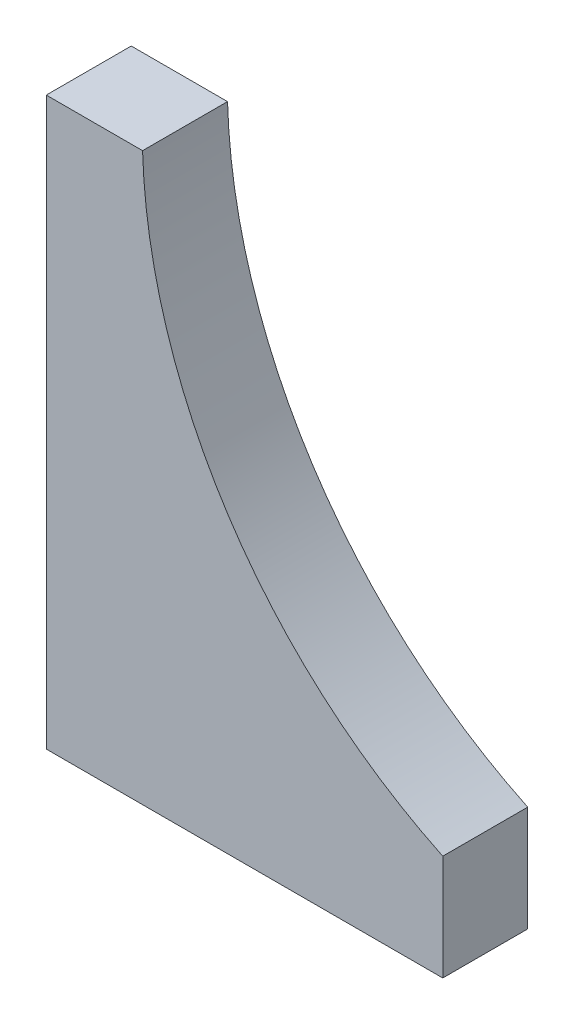
ISO-10303-21;
HEADER;
FILE_DESCRIPTION(('STEP AP214'),'2;1');
FILE_NAME('part.step','',(''),(''),'','','');
FILE_SCHEMA(('AUTOMOTIVE_DESIGN { 1 0 10303 214 1 1 1 1 }'));
ENDSEC;
DATA;
#1=APPLICATION_CONTEXT('core data for automotive mechanical design processes');
#2=APPLICATION_PROTOCOL_DEFINITION('international standard','automotive_design',2000,#1);
#3=PRODUCT_CONTEXT('',#1,'mechanical');
#4=PRODUCT('Part','Part','',(#3));
#5=PRODUCT_RELATED_PRODUCT_CATEGORY('part','',(#4));
#6=PRODUCT_DEFINITION_FORMATION('','',#4);
#7=PRODUCT_DEFINITION_CONTEXT('part definition',#1,'design');
#8=PRODUCT_DEFINITION('design','',#6,#7);
#9=PRODUCT_DEFINITION_SHAPE('','',#8);
#10=(LENGTH_UNIT() NAMED_UNIT(*) SI_UNIT(.MILLI.,.METRE.));
#11=(NAMED_UNIT(*) PLANE_ANGLE_UNIT() SI_UNIT($,.RADIAN.));
#12=(NAMED_UNIT(*) SI_UNIT($,.STERADIAN.) SOLID_ANGLE_UNIT());
#13=UNCERTAINTY_MEASURE_WITH_UNIT(LENGTH_MEASURE(1.E-05),#10,'distance_accuracy_value','');
#14=(GEOMETRIC_REPRESENTATION_CONTEXT(3) GLOBAL_UNCERTAINTY_ASSIGNED_CONTEXT((#13)) GLOBAL_UNIT_ASSIGNED_CONTEXT((#10,
#11,#12)) REPRESENTATION_CONTEXT('',''));
#15=CARTESIAN_POINT('',(0.,0.,0.));
#16=DIRECTION('',(0.,0.,1.));
#17=DIRECTION('',(1.,0.,0.));
#18=AXIS2_PLACEMENT_3D('',#15,#16,#17);
#19=CARTESIAN_POINT('',(0.,0.,15.));
#20=DIRECTION('',(1.,0.,0.));
#21=DIRECTION('',(0.,0.,-1.));
#22=AXIS2_PLACEMENT_3D('',#19,#20,#21);
#23=PLANE('',#22);
#24=CARTESIAN_POINT('',(0.,85.,7.5));
#25=DIRECTION('',(-1.,0.,0.));
#26=DIRECTION('',(0.,0.,1.));
#27=AXIS2_PLACEMENT_3D('',#24,#25,#26);
#28=CIRCLE('',#27,2.5);
#29=CARTESIAN_POINT('',(0.,85.,10.));
#30=VERTEX_POINT('',#29);
#31=EDGE_CURVE('E149',#30,#30,#28,.T.);
#32=ORIENTED_EDGE('',*,*,#31,.F.);
#33=EDGE_LOOP('',(#32));
#34=FACE_BOUND('',#33,.T.);
#35=CARTESIAN_POINT('',(0.,25.,7.5));
#36=DIRECTION('',(-1.,0.,0.));
#37=DIRECTION('',(0.,0.,1.));
#38=AXIS2_PLACEMENT_3D('',#35,#36,#37);
#39=CIRCLE('',#38,2.5);
#40=CARTESIAN_POINT('',(0.,25.,10.));
#41=VERTEX_POINT('',#40);
#42=EDGE_CURVE('E152',#41,#41,#39,.T.);
#43=ORIENTED_EDGE('',*,*,#42,.F.);
#44=EDGE_LOOP('',(#43));
#45=FACE_BOUND('',#44,.T.);
#46=DIRECTION('',(0.,-1.,0.));
#47=VECTOR('',#46,1.);
#48=CARTESIAN_POINT('',(0.,0.,0.));
#49=LINE('',#48,#47);
#50=CARTESIAN_POINT('',(0.,100.,0.));
#51=VERTEX_POINT('',#50);
#52=CARTESIAN_POINT('',(0.,0.,0.));
#53=VERTEX_POINT('',#52);
#54=EDGE_CURVE('E112',#51,#53,#49,.T.);
#55=ORIENTED_EDGE('',*,*,#54,.T.);
#56=DIRECTION('',(0.,0.,-1.));
#57=VECTOR('',#56,1.);
#58=CARTESIAN_POINT('',(0.,0.,15.));
#59=LINE('',#58,#57);
#60=CARTESIAN_POINT('',(0.,0.,15.));
#61=VERTEX_POINT('',#60);
#62=EDGE_CURVE('E11',#61,#53,#59,.T.);
#63=ORIENTED_EDGE('',*,*,#62,.F.);
#64=DIRECTION('',(0.,-1.,0.));
#65=VECTOR('',#64,1.);
#66=CARTESIAN_POINT('',(0.,0.,15.));
#67=LINE('',#66,#65);
#68=CARTESIAN_POINT('',(0.,100.,15.));
#69=VERTEX_POINT('',#68);
#70=EDGE_CURVE('E121',#69,#61,#67,.T.);
#71=ORIENTED_EDGE('',*,*,#70,.F.);
#72=DIRECTION('',(0.,0.,-1.));
#73=VECTOR('',#72,1.);
#74=CARTESIAN_POINT('',(0.,100.,15.));
#75=LINE('',#74,#73);
#76=EDGE_CURVE('E108',#69,#51,#75,.T.);
#77=ORIENTED_EDGE('',*,*,#76,.T.);
#78=EDGE_LOOP('',(#55,#63,#71,#77));
#79=FACE_BOUND('',#78,.T.);
#80=ADVANCED_FACE('F34',(#34,#45,#79),#23,.F.);
#81=CARTESIAN_POINT('',(0.,0.,15.));
#82=DIRECTION('',(0.,1.,0.));
#83=DIRECTION('',(0.,0.,1.));
#84=AXIS2_PLACEMENT_3D('',#81,#82,#83);
#85=PLANE('',#84);
#86=CARTESIAN_POINT('',(55.,0.,7.5));
#87=DIRECTION('',(0.,-1.,0.));
#88=DIRECTION('',(0.,0.,-1.));
#89=AXIS2_PLACEMENT_3D('',#86,#87,#88);
#90=CIRCLE('',#89,2.5);
#91=CARTESIAN_POINT('',(55.,0.,5.));
#92=VERTEX_POINT('',#91);
#93=EDGE_CURVE('E170',#92,#92,#90,.T.);
#94=ORIENTED_EDGE('',*,*,#93,.F.);
#95=EDGE_LOOP('',(#94));
#96=FACE_BOUND('',#95,.T.);
#97=CARTESIAN_POINT('',(20.,0.,7.5));
#98=DIRECTION('',(0.,-1.,0.));
#99=DIRECTION('',(0.,0.,-1.));
#100=AXIS2_PLACEMENT_3D('',#97,#98,#99);
#101=CIRCLE('',#100,2.5);
#102=CARTESIAN_POINT('',(20.,0.,5.));
#103=VERTEX_POINT('',#102);
#104=EDGE_CURVE('E164',#103,#103,#101,.T.);
#105=ORIENTED_EDGE('',*,*,#104,.F.);
#106=EDGE_LOOP('',(#105));
#107=FACE_BOUND('',#106,.T.);
#108=DIRECTION('',(1.,0.,0.));
#109=VECTOR('',#108,1.);
#110=CARTESIAN_POINT('',(0.,0.,0.));
#111=LINE('',#110,#109);
#112=CARTESIAN_POINT('',(70.,0.,0.));
#113=VERTEX_POINT('',#112);
#114=EDGE_CURVE('E115',#53,#113,#111,.T.);
#115=ORIENTED_EDGE('',*,*,#114,.T.);
#116=DIRECTION('',(0.,0.,-1.));
#117=VECTOR('',#116,1.);
#118=CARTESIAN_POINT('',(70.,0.,15.));
#119=LINE('',#118,#117);
#120=CARTESIAN_POINT('',(70.,0.,15.));
#121=VERTEX_POINT('',#120);
#122=EDGE_CURVE('E42',#121,#113,#119,.T.);
#123=ORIENTED_EDGE('',*,*,#122,.F.);
#124=DIRECTION('',(1.,0.,0.));
#125=VECTOR('',#124,1.);
#126=CARTESIAN_POINT('',(0.,0.,15.));
#127=LINE('',#126,#125);
#128=EDGE_CURVE('E85',#61,#121,#127,.T.);
#129=ORIENTED_EDGE('',*,*,#128,.F.);
#130=ORIENTED_EDGE('',*,*,#62,.T.);
#131=EDGE_LOOP('',(#115,#123,#129,#130));
#132=FACE_BOUND('',#131,.T.);
#133=ADVANCED_FACE('F140',(#96,#107,#132),#85,.F.);
#134=CARTESIAN_POINT('',(70.,0.,15.));
#135=DIRECTION('',(-1.,0.,0.));
#136=DIRECTION('',(0.,0.,1.));
#137=AXIS2_PLACEMENT_3D('',#134,#135,#136);
#138=PLANE('',#137);
#139=DIRECTION('',(0.,1.,0.));
#140=VECTOR('',#139,1.);
#141=CARTESIAN_POINT('',(70.,0.,0.));
#142=LINE('',#141,#140);
#143=CARTESIAN_POINT('',(70.,18.6251488613543,0.));
#144=VERTEX_POINT('',#143);
#145=EDGE_CURVE('E103',#113,#144,#142,.T.);
#146=ORIENTED_EDGE('',*,*,#145,.T.);
#147=DIRECTION('',(0.,0.,-1.));
#148=VECTOR('',#147,1.);
#149=CARTESIAN_POINT('',(70.,18.6251488613543,15.));
#150=LINE('',#149,#148);
#151=CARTESIAN_POINT('',(70.,18.6251488613543,15.));
#152=VERTEX_POINT('',#151);
#153=EDGE_CURVE('E100',#152,#144,#150,.T.);
#154=ORIENTED_EDGE('',*,*,#153,.F.);
#155=DIRECTION('',(0.,1.,0.));
#156=VECTOR('',#155,1.);
#157=CARTESIAN_POINT('',(70.,0.,15.));
#158=LINE('',#157,#156);
#159=EDGE_CURVE('E92',#121,#152,#158,.T.);
#160=ORIENTED_EDGE('',*,*,#159,.F.);
#161=ORIENTED_EDGE('',*,*,#122,.T.);
#162=EDGE_LOOP('',(#146,#154,#160,#161));
#163=FACE_BOUND('',#162,.T.);
#164=ADVANCED_FACE('F101',(#163),#138,.F.);
#165=CARTESIAN_POINT('',(110.262353580865,102.795354310141,15.));
#166=DIRECTION('',(0.,0.,-1.));
#167=DIRECTION('',(-1.,0.,0.));
#168=AXIS2_PLACEMENT_3D('',#165,#166,#167);
#169=CYLINDRICAL_SURFACE('',#168,93.3042367803392);
#170=CARTESIAN_POINT('',(110.262353580865,102.795354310141,0.));
#171=DIRECTION('',(0.,0.,-1.));
#172=DIRECTION('',(1.,0.,0.));
#173=AXIS2_PLACEMENT_3D('',#170,#171,#172);
#174=CIRCLE('',#173,93.3042367803392);
#175=CARTESIAN_POINT('',(17.,100.,0.));
#176=VERTEX_POINT('',#175);
#177=EDGE_CURVE('E71',#144,#176,#174,.T.);
#178=ORIENTED_EDGE('',*,*,#177,.T.);
#179=DIRECTION('',(0.,0.,-1.));
#180=VECTOR('',#179,1.);
#181=CARTESIAN_POINT('',(17.,100.,15.));
#182=LINE('',#181,#180);
#183=CARTESIAN_POINT('',(17.,100.,15.));
#184=VERTEX_POINT('',#183);
#185=EDGE_CURVE('E104',#184,#176,#182,.T.);
#186=ORIENTED_EDGE('',*,*,#185,.F.);
#187=CARTESIAN_POINT('',(110.262353580865,102.795354310141,15.));
#188=DIRECTION('',(0.,0.,-1.));
#189=DIRECTION('',(1.,0.,0.));
#190=AXIS2_PLACEMENT_3D('',#187,#188,#189);
#191=CIRCLE('',#190,93.3042367803392);
#192=EDGE_CURVE('E96',#152,#184,#191,.T.);
#193=ORIENTED_EDGE('',*,*,#192,.F.);
#194=ORIENTED_EDGE('',*,*,#153,.T.);
#195=EDGE_LOOP('',(#178,#186,#193,#194));
#196=FACE_BOUND('',#195,.T.);
#197=ADVANCED_FACE('F106',(#196),#169,.F.);
#198=CARTESIAN_POINT('',(0.,100.,15.));
#199=DIRECTION('',(0.,-1.,0.));
#200=DIRECTION('',(0.,0.,-1.));
#201=AXIS2_PLACEMENT_3D('',#198,#199,#200);
#202=PLANE('',#201);
#203=DIRECTION('',(-1.,0.,0.));
#204=VECTOR('',#203,1.);
#205=CARTESIAN_POINT('',(0.,100.,0.));
#206=LINE('',#205,#204);
#207=EDGE_CURVE('E77',#176,#51,#206,.T.);
#208=ORIENTED_EDGE('',*,*,#207,.T.);
#209=ORIENTED_EDGE('',*,*,#76,.F.);
#210=DIRECTION('',(-1.,0.,0.));
#211=VECTOR('',#210,1.);
#212=CARTESIAN_POINT('',(0.,100.,15.));
#213=LINE('',#212,#211);
#214=EDGE_CURVE('E50',#184,#69,#213,.T.);
#215=ORIENTED_EDGE('',*,*,#214,.F.);
#216=ORIENTED_EDGE('',*,*,#185,.T.);
#217=EDGE_LOOP('',(#208,#209,#215,#216));
#218=FACE_BOUND('',#217,.T.);
#219=ADVANCED_FACE('F129',(#218),#202,.F.);
#220=CARTESIAN_POINT('',(110.262353580865,102.795354310141,15.));
#221=DIRECTION('',(0.,0.,1.));
#222=DIRECTION('',(1.,0.,0.));
#223=AXIS2_PLACEMENT_3D('',#220,#221,#222);
#224=PLANE('',#223);
#225=ORIENTED_EDGE('',*,*,#70,.T.);
#226=ORIENTED_EDGE('',*,*,#128,.T.);
#227=ORIENTED_EDGE('',*,*,#159,.T.);
#228=ORIENTED_EDGE('',*,*,#192,.T.);
#229=ORIENTED_EDGE('',*,*,#214,.T.);
#230=EDGE_LOOP('',(#225,#226,#227,#228,#229));
#231=FACE_BOUND('',#230,.T.);
#232=ADVANCED_FACE('F94',(#231),#224,.T.);
#233=CARTESIAN_POINT('',(110.262353580865,102.795354310141,0.));
#234=DIRECTION('',(0.,0.,1.));
#235=DIRECTION('',(1.,0.,0.));
#236=AXIS2_PLACEMENT_3D('',#233,#234,#235);
#237=PLANE('',#236);
#238=ORIENTED_EDGE('',*,*,#54,.F.);
#239=ORIENTED_EDGE('',*,*,#207,.F.);
#240=ORIENTED_EDGE('',*,*,#177,.F.);
#241=ORIENTED_EDGE('',*,*,#145,.F.);
#242=ORIENTED_EDGE('',*,*,#114,.F.);
#243=EDGE_LOOP('',(#238,#239,#240,#241,#242));
#244=FACE_BOUND('',#243,.T.);
#245=ADVANCED_FACE('F125',(#244),#237,.F.);
#246=CARTESIAN_POINT('',(16.,25.,7.5));
#247=DIRECTION('',(-1.,0.,0.));
#248=DIRECTION('',(0.,0.,1.));
#249=AXIS2_PLACEMENT_3D('',#246,#247,#248);
#250=CYLINDRICAL_SURFACE('',#249,2.5);
#251=CARTESIAN_POINT('',(16.,25.,7.5));
#252=DIRECTION('',(-1.,0.,0.));
#253=DIRECTION('',(0.,0.,1.));
#254=AXIS2_PLACEMENT_3D('',#251,#252,#253);
#255=CIRCLE('',#254,2.5);
#256=CARTESIAN_POINT('',(16.,25.,10.));
#257=VERTEX_POINT('',#256);
#258=EDGE_CURVE('E116',#257,#257,#255,.T.);
#259=ORIENTED_EDGE('',*,*,#258,.F.);
#260=EDGE_LOOP('',(#259));
#261=FACE_BOUND('',#260,.T.);
#262=ORIENTED_EDGE('',*,*,#42,.T.);
#263=EDGE_LOOP('',(#262));
#264=FACE_BOUND('',#263,.T.);
#265=ADVANCED_FACE('F719',(#261,#264),#250,.F.);
#266=CARTESIAN_POINT('',(16.,25.,7.5));
#267=DIRECTION('',(-1.,0.,0.));
#268=DIRECTION('',(0.,0.,1.));
#269=AXIS2_PLACEMENT_3D('',#266,#267,#268);
#270=PLANE('',#269);
#271=ORIENTED_EDGE('',*,*,#258,.T.);
#272=EDGE_LOOP('',(#271));
#273=FACE_BOUND('',#272,.T.);
#274=ADVANCED_FACE('F705',(#273),#270,.T.);
#275=CARTESIAN_POINT('',(16.,85.,7.5));
#276=DIRECTION('',(-1.,0.,0.));
#277=DIRECTION('',(0.,0.,1.));
#278=AXIS2_PLACEMENT_3D('',#275,#276,#277);
#279=CYLINDRICAL_SURFACE('',#278,2.5);
#280=CARTESIAN_POINT('',(16.,85.,7.5));
#281=DIRECTION('',(-1.,0.,0.));
#282=DIRECTION('',(0.,0.,1.));
#283=AXIS2_PLACEMENT_3D('',#280,#281,#282);
#284=CIRCLE('',#283,2.5);
#285=CARTESIAN_POINT('',(16.,85.,10.));
#286=VERTEX_POINT('',#285);
#287=EDGE_CURVE('E154',#286,#286,#284,.T.);
#288=ORIENTED_EDGE('',*,*,#287,.F.);
#289=EDGE_LOOP('',(#288));
#290=FACE_BOUND('',#289,.T.);
#291=ORIENTED_EDGE('',*,*,#31,.T.);
#292=EDGE_LOOP('',(#291));
#293=FACE_BOUND('',#292,.T.);
#294=ADVANCED_FACE('F696',(#290,#293),#279,.F.);
#295=CARTESIAN_POINT('',(16.,85.,7.5));
#296=DIRECTION('',(-1.,0.,0.));
#297=DIRECTION('',(0.,0.,1.));
#298=AXIS2_PLACEMENT_3D('',#295,#296,#297);
#299=PLANE('',#298);
#300=ORIENTED_EDGE('',*,*,#287,.T.);
#301=EDGE_LOOP('',(#300));
#302=FACE_BOUND('',#301,.T.);
#303=ADVANCED_FACE('F686',(#302),#299,.T.);
#304=CARTESIAN_POINT('',(20.,16.,7.5));
#305=DIRECTION('',(0.,-1.,0.));
#306=DIRECTION('',(0.,0.,-1.));
#307=AXIS2_PLACEMENT_3D('',#304,#305,#306);
#308=CYLINDRICAL_SURFACE('',#307,2.5);
#309=CARTESIAN_POINT('',(20.,16.,7.5));
#310=DIRECTION('',(0.,-1.,0.));
#311=DIRECTION('',(0.,0.,-1.));
#312=AXIS2_PLACEMENT_3D('',#309,#310,#311);
#313=CIRCLE('',#312,2.5);
#314=CARTESIAN_POINT('',(20.,16.,5.));
#315=VERTEX_POINT('',#314);
#316=EDGE_CURVE('E162',#315,#315,#313,.T.);
#317=ORIENTED_EDGE('',*,*,#316,.F.);
#318=EDGE_LOOP('',(#317));
#319=FACE_BOUND('',#318,.T.);
#320=ORIENTED_EDGE('',*,*,#104,.T.);
#321=EDGE_LOOP('',(#320));
#322=FACE_BOUND('',#321,.T.);
#323=ADVANCED_FACE('F676',(#319,#322),#308,.F.);
#324=CARTESIAN_POINT('',(20.,16.,7.5));
#325=DIRECTION('',(0.,-1.,0.));
#326=DIRECTION('',(0.,0.,-1.));
#327=AXIS2_PLACEMENT_3D('',#324,#325,#326);
#328=PLANE('',#327);
#329=ORIENTED_EDGE('',*,*,#316,.T.);
#330=EDGE_LOOP('',(#329));
#331=FACE_BOUND('',#330,.T.);
#332=ADVANCED_FACE('F657',(#331),#328,.T.);
#333=CARTESIAN_POINT('',(55.,16.,7.5));
#334=DIRECTION('',(0.,-1.,0.));
#335=DIRECTION('',(0.,0.,-1.));
#336=AXIS2_PLACEMENT_3D('',#333,#334,#335);
#337=CYLINDRICAL_SURFACE('',#336,2.5);
#338=CARTESIAN_POINT('',(55.,16.,7.5));
#339=DIRECTION('',(0.,-1.,0.));
#340=DIRECTION('',(0.,0.,-1.));
#341=AXIS2_PLACEMENT_3D('',#338,#339,#340);
#342=CIRCLE('',#341,2.5);
#343=CARTESIAN_POINT('',(55.,16.,5.));
#344=VERTEX_POINT('',#343);
#345=EDGE_CURVE('E167',#344,#344,#342,.T.);
#346=ORIENTED_EDGE('',*,*,#345,.F.);
#347=EDGE_LOOP('',(#346));
#348=FACE_BOUND('',#347,.T.);
#349=ORIENTED_EDGE('',*,*,#93,.T.);
#350=EDGE_LOOP('',(#349));
#351=FACE_BOUND('',#350,.T.);
#352=ADVANCED_FACE('F647',(#348,#351),#337,.F.);
#353=CARTESIAN_POINT('',(55.,16.,7.5));
#354=DIRECTION('',(0.,-1.,0.));
#355=DIRECTION('',(0.,0.,-1.));
#356=AXIS2_PLACEMENT_3D('',#353,#354,#355);
#357=PLANE('',#356);
#358=ORIENTED_EDGE('',*,*,#345,.T.);
#359=EDGE_LOOP('',(#358));
#360=FACE_BOUND('',#359,.T.);
#361=ADVANCED_FACE('F644',(#360),#357,.T.);
#362=CLOSED_SHELL('',(#80,#133,#164,#197,#219,#232,#245,#265,#274,#294,#303,#323,#332,#352,#361));
#363=CARTESIAN_POINT('',(4.,18.5,3.));
#364=DIRECTION('',(-1.,0.,0.));
#365=DIRECTION('',(0.,-1.,0.));
#366=AXIS2_PLACEMENT_3D('',#363,#364,#365);
#367=PLANE('',#366);
#368=DIRECTION('',(0.,-1.,0.));
#369=VECTOR('',#368,1.);
#370=CARTESIAN_POINT('',(4.,18.5,12.));
#371=LINE('',#370,#369);
#372=CARTESIAN_POINT('',(4.,18.5,12.));
#373=VERTEX_POINT('',#372);
#374=CARTESIAN_POINT('',(4.,4.,12.));
#375=VERTEX_POINT('',#374);
#376=EDGE_CURVE('E281',#373,#375,#371,.T.);
#377=ORIENTED_EDGE('',*,*,#376,.T.);
#378=DIRECTION('',(0.,0.,1.));
#379=VECTOR('',#378,1.);
#380=CARTESIAN_POINT('',(4.,4.,3.));
#381=LINE('',#380,#379);
#382=CARTESIAN_POINT('',(4.,4.,3.));
#383=VERTEX_POINT('',#382);
#384=EDGE_CURVE('E257',#383,#375,#381,.T.);
#385=ORIENTED_EDGE('',*,*,#384,.F.);
#386=DIRECTION('',(0.,-1.,0.));
#387=VECTOR('',#386,1.);
#388=CARTESIAN_POINT('',(4.,18.5,3.));
#389=LINE('',#388,#387);
#390=CARTESIAN_POINT('',(4.,18.5,3.));
#391=VERTEX_POINT('',#390);
#392=EDGE_CURVE('E274',#391,#383,#389,.T.);
#393=ORIENTED_EDGE('',*,*,#392,.F.);
#394=DIRECTION('',(0.,0.,1.));
#395=VECTOR('',#394,1.);
#396=CARTESIAN_POINT('',(4.,18.5,3.));
#397=LINE('',#396,#395);
#398=EDGE_CURVE('E267',#391,#373,#397,.T.);
#399=ORIENTED_EDGE('',*,*,#398,.T.);
#400=EDGE_LOOP('',(#377,#385,#393,#399));
#401=FACE_BOUND('',#400,.T.);
#402=ADVANCED_FACE('F474',(#401),#367,.F.);
#403=CARTESIAN_POINT('',(4.,18.5,3.));
#404=DIRECTION('',(0.,1.,0.));
#405=DIRECTION('',(0.,0.,1.));
#406=AXIS2_PLACEMENT_3D('',#403,#404,#405);
#407=PLANE('',#406);
#408=DIRECTION('',(-1.,0.,0.));
#409=VECTOR('',#408,1.);
#410=CARTESIAN_POINT('',(4.,18.5,12.));
#411=LINE('',#410,#409);
#412=CARTESIAN_POINT('',(13.5,18.5,12.));
#413=VERTEX_POINT('',#412);
#414=EDGE_CURVE('E271',#413,#373,#411,.T.);
#415=ORIENTED_EDGE('',*,*,#414,.T.);
#416=ORIENTED_EDGE('',*,*,#398,.F.);
#417=DIRECTION('',(-1.,0.,0.));
#418=VECTOR('',#417,1.);
#419=CARTESIAN_POINT('',(4.,18.5,3.));
#420=LINE('',#419,#418);
#421=CARTESIAN_POINT('',(13.5,18.5,3.));
#422=VERTEX_POINT('',#421);
#423=EDGE_CURVE('E261',#422,#391,#420,.T.);
#424=ORIENTED_EDGE('',*,*,#423,.F.);
#425=DIRECTION('',(0.,0.,1.));
#426=VECTOR('',#425,1.);
#427=CARTESIAN_POINT('',(13.5,18.5,3.));
#428=LINE('',#427,#426);
#429=EDGE_CURVE('E264',#422,#413,#428,.T.);
#430=ORIENTED_EDGE('',*,*,#429,.T.);
#431=EDGE_LOOP('',(#415,#416,#424,#430));
#432=FACE_BOUND('',#431,.T.);
#433=ADVANCED_FACE('F470',(#432),#407,.F.);
#434=CARTESIAN_POINT('',(13.5,18.5,3.));
#435=DIRECTION('',(1.,0.,0.));
#436=DIRECTION('',(0.,1.,0.));
#437=AXIS2_PLACEMENT_3D('',#434,#435,#436);
#438=PLANE('',#437);
#439=DIRECTION('',(0.,1.,0.));
#440=VECTOR('',#439,1.);
#441=CARTESIAN_POINT('',(13.5,18.5,12.));
#442=LINE('',#441,#440);
#443=CARTESIAN_POINT('',(13.5,4.,12.));
#444=VERTEX_POINT('',#443);
#445=EDGE_CURVE('E275',#444,#413,#442,.T.);
#446=ORIENTED_EDGE('',*,*,#445,.T.);
#447=ORIENTED_EDGE('',*,*,#429,.F.);
#448=DIRECTION('',(0.,1.,0.));
#449=VECTOR('',#448,1.);
#450=CARTESIAN_POINT('',(13.5,18.5,3.));
#451=LINE('',#450,#449);
#452=CARTESIAN_POINT('',(13.5,4.,3.));
#453=VERTEX_POINT('',#452);
#454=EDGE_CURVE('E286',#453,#422,#451,.T.);
#455=ORIENTED_EDGE('',*,*,#454,.F.);
#456=DIRECTION('',(0.,0.,1.));
#457=VECTOR('',#456,1.);
#458=CARTESIAN_POINT('',(13.5,4.,3.));
#459=LINE('',#458,#457);
#460=EDGE_CURVE('E260',#453,#444,#459,.T.);
#461=ORIENTED_EDGE('',*,*,#460,.T.);
#462=EDGE_LOOP('',(#446,#447,#455,#461));
#463=FACE_BOUND('',#462,.T.);
#464=ADVANCED_FACE('F473',(#463),#438,.F.);
#465=CARTESIAN_POINT('',(4.,4.,3.));
#466=DIRECTION('',(0.,-1.,0.));
#467=DIRECTION('',(0.,0.,-1.));
#468=AXIS2_PLACEMENT_3D('',#465,#466,#467);
#469=PLANE('',#468);
#470=DIRECTION('',(1.,0.,0.));
#471=VECTOR('',#470,1.);
#472=CARTESIAN_POINT('',(4.,4.,12.));
#473=LINE('',#472,#471);
#474=EDGE_CURVE('E278',#375,#444,#473,.T.);
#475=ORIENTED_EDGE('',*,*,#474,.T.);
#476=ORIENTED_EDGE('',*,*,#460,.F.);
#477=DIRECTION('',(1.,0.,0.));
#478=VECTOR('',#477,1.);
#479=CARTESIAN_POINT('',(4.,4.,3.));
#480=LINE('',#479,#478);
#481=EDGE_CURVE('E289',#383,#453,#480,.T.);
#482=ORIENTED_EDGE('',*,*,#481,.F.);
#483=ORIENTED_EDGE('',*,*,#384,.T.);
#484=EDGE_LOOP('',(#475,#476,#482,#483));
#485=FACE_BOUND('',#484,.T.);
#486=ADVANCED_FACE('F466',(#485),#469,.F.);
#487=CARTESIAN_POINT('',(0.,0.,3.));
#488=DIRECTION('',(0.,0.,1.));
#489=DIRECTION('',(1.,0.,0.));
#490=AXIS2_PLACEMENT_3D('',#487,#488,#489);
#491=PLANE('',#490);
#492=ORIENTED_EDGE('',*,*,#392,.T.);
#493=ORIENTED_EDGE('',*,*,#481,.T.);
#494=ORIENTED_EDGE('',*,*,#454,.T.);
#495=ORIENTED_EDGE('',*,*,#423,.T.);
#496=EDGE_LOOP('',(#492,#493,#494,#495));
#497=FACE_BOUND('',#496,.T.);
#498=ADVANCED_FACE('F462',(#497),#491,.T.);
#499=CARTESIAN_POINT('',(0.,0.,12.));
#500=DIRECTION('',(0.,0.,1.));
#501=DIRECTION('',(1.,0.,0.));
#502=AXIS2_PLACEMENT_3D('',#499,#500,#501);
#503=PLANE('',#502);
#504=ORIENTED_EDGE('',*,*,#376,.F.);
#505=ORIENTED_EDGE('',*,*,#414,.F.);
#506=ORIENTED_EDGE('',*,*,#445,.F.);
#507=ORIENTED_EDGE('',*,*,#474,.F.);
#508=EDGE_LOOP('',(#504,#505,#506,#507));
#509=FACE_BOUND('',#508,.T.);
#510=ADVANCED_FACE('F465',(#509),#503,.F.);
#511=CLOSED_SHELL('',(#402,#433,#464,#486,#498,#510));
#512=CARTESIAN_POINT('',(3.,97.,3.));
#513=DIRECTION('',(0.,1.,0.));
#514=DIRECTION('',(0.,0.,1.));
#515=AXIS2_PLACEMENT_3D('',#512,#513,#514);
#516=PLANE('',#515);
#517=DIRECTION('',(-1.,0.,0.));
#518=VECTOR('',#517,1.);
#519=CARTESIAN_POINT('',(3.,97.,12.));
#520=LINE('',#519,#518);
#521=CARTESIAN_POINT('',(14.,97.,12.));
#522=VERTEX_POINT('',#521);
#523=CARTESIAN_POINT('',(3.,97.,12.));
#524=VERTEX_POINT('',#523);
#525=EDGE_CURVE('E270',#522,#524,#520,.T.);
#526=ORIENTED_EDGE('',*,*,#525,.T.);
#527=DIRECTION('',(0.,0.,1.));
#528=VECTOR('',#527,1.);
#529=CARTESIAN_POINT('',(3.,97.,3.));
#530=LINE('',#529,#528);
#531=CARTESIAN_POINT('',(3.,97.,3.));
#532=VERTEX_POINT('',#531);
#533=EDGE_CURVE('E294',#532,#524,#530,.T.);
#534=ORIENTED_EDGE('',*,*,#533,.F.);
#535=DIRECTION('',(-1.,0.,0.));
#536=VECTOR('',#535,1.);
#537=CARTESIAN_POINT('',(3.,97.,3.));
#538=LINE('',#537,#536);
#539=CARTESIAN_POINT('',(14.,97.,3.));
#540=VERTEX_POINT('',#539);
#541=EDGE_CURVE('E309',#540,#532,#538,.T.);
#542=ORIENTED_EDGE('',*,*,#541,.F.);
#543=DIRECTION('',(0.,0.,1.));
#544=VECTOR('',#543,1.);
#545=CARTESIAN_POINT('',(14.,97.,3.));
#546=LINE('',#545,#544);
#547=EDGE_CURVE('E231',#540,#522,#546,.T.);
#548=ORIENTED_EDGE('',*,*,#547,.T.);
#549=EDGE_LOOP('',(#526,#534,#542,#548));
#550=FACE_BOUND('',#549,.T.);
#551=ADVANCED_FACE('F339',(#550),#516,.F.);
#552=CARTESIAN_POINT('',(14.,97.,3.));
#553=DIRECTION('',(1.,0.,0.));
#554=DIRECTION('',(0.,0.,-1.));
#555=AXIS2_PLACEMENT_3D('',#552,#553,#554);
#556=PLANE('',#555);
#557=DIRECTION('',(0.,1.,0.));
#558=VECTOR('',#557,1.);
#559=CARTESIAN_POINT('',(14.,97.,12.));
#560=LINE('',#559,#558);
#561=CARTESIAN_POINT('',(14.,90.5,12.));
#562=VERTEX_POINT('',#561);
#563=EDGE_CURVE('E306',#562,#522,#560,.T.);
#564=ORIENTED_EDGE('',*,*,#563,.T.);
#565=ORIENTED_EDGE('',*,*,#547,.F.);
#566=DIRECTION('',(0.,1.,0.));
#567=VECTOR('',#566,1.);
#568=CARTESIAN_POINT('',(14.,97.,3.));
#569=LINE('',#568,#567);
#570=CARTESIAN_POINT('',(14.,90.5,3.));
#571=VERTEX_POINT('',#570);
#572=EDGE_CURVE('E298',#571,#540,#569,.T.);
#573=ORIENTED_EDGE('',*,*,#572,.F.);
#574=DIRECTION('',(0.,0.,1.));
#575=VECTOR('',#574,1.);
#576=CARTESIAN_POINT('',(14.,90.5,3.));
#577=LINE('',#576,#575);
#578=EDGE_CURVE('E301',#571,#562,#577,.T.);
#579=ORIENTED_EDGE('',*,*,#578,.T.);
#580=EDGE_LOOP('',(#564,#565,#573,#579));
#581=FACE_BOUND('',#580,.T.);
#582=ADVANCED_FACE('F449',(#581),#556,.F.);
#583=CARTESIAN_POINT('',(3.,90.5,3.));
#584=DIRECTION('',(0.,-1.,0.));
#585=DIRECTION('',(0.,0.,-1.));
#586=AXIS2_PLACEMENT_3D('',#583,#584,#585);
#587=PLANE('',#586);
#588=DIRECTION('',(1.,0.,0.));
#589=VECTOR('',#588,1.);
#590=CARTESIAN_POINT('',(3.,90.5,12.));
#591=LINE('',#590,#589);
#592=CARTESIAN_POINT('',(3.,90.5,12.));
#593=VERTEX_POINT('',#592);
#594=EDGE_CURVE('E310',#593,#562,#591,.T.);
#595=ORIENTED_EDGE('',*,*,#594,.T.);
#596=ORIENTED_EDGE('',*,*,#578,.F.);
#597=DIRECTION('',(1.,0.,0.));
#598=VECTOR('',#597,1.);
#599=CARTESIAN_POINT('',(3.,90.5,3.));
#600=LINE('',#599,#598);
#601=CARTESIAN_POINT('',(3.,90.5,3.));
#602=VERTEX_POINT('',#601);
#603=EDGE_CURVE('E320',#602,#571,#600,.T.);
#604=ORIENTED_EDGE('',*,*,#603,.F.);
#605=DIRECTION('',(0.,0.,1.));
#606=VECTOR('',#605,1.);
#607=CARTESIAN_POINT('',(3.,90.5,3.));
#608=LINE('',#607,#606);
#609=EDGE_CURVE('E297',#602,#593,#608,.T.);
#610=ORIENTED_EDGE('',*,*,#609,.T.);
#611=EDGE_LOOP('',(#595,#596,#604,#610));
#612=FACE_BOUND('',#611,.T.);
#613=ADVANCED_FACE('F456',(#612),#587,.F.);
#614=CARTESIAN_POINT('',(3.,97.,3.));
#615=DIRECTION('',(-1.,0.,0.));
#616=DIRECTION('',(0.,-1.,0.));
#617=AXIS2_PLACEMENT_3D('',#614,#615,#616);
#618=PLANE('',#617);
#619=DIRECTION('',(0.,-1.,0.));
#620=VECTOR('',#619,1.);
#621=CARTESIAN_POINT('',(3.,97.,12.));
#622=LINE('',#621,#620);
#623=EDGE_CURVE('E313',#524,#593,#622,.T.);
#624=ORIENTED_EDGE('',*,*,#623,.T.);
#625=ORIENTED_EDGE('',*,*,#609,.F.);
#626=DIRECTION('',(0.,-1.,0.));
#627=VECTOR('',#626,1.);
#628=CARTESIAN_POINT('',(3.,97.,3.));
#629=LINE('',#628,#627);
#630=EDGE_CURVE('E323',#532,#602,#629,.T.);
#631=ORIENTED_EDGE('',*,*,#630,.F.);
#632=ORIENTED_EDGE('',*,*,#533,.T.);
#633=EDGE_LOOP('',(#624,#625,#631,#632));
#634=FACE_BOUND('',#633,.T.);
#635=ADVANCED_FACE('F460',(#634),#618,.F.);
#636=CARTESIAN_POINT('',(0.,0.,3.));
#637=DIRECTION('',(0.,0.,-1.));
#638=DIRECTION('',(-1.,0.,0.));
#639=AXIS2_PLACEMENT_3D('',#636,#637,#638);
#640=PLANE('',#639);
#641=ORIENTED_EDGE('',*,*,#541,.T.);
#642=ORIENTED_EDGE('',*,*,#630,.T.);
#643=ORIENTED_EDGE('',*,*,#603,.T.);
#644=ORIENTED_EDGE('',*,*,#572,.T.);
#645=EDGE_LOOP('',(#641,#642,#643,#644));
#646=FACE_BOUND('',#645,.T.);
#647=ADVANCED_FACE('F330',(#646),#640,.F.);
#648=CARTESIAN_POINT('',(0.,0.,12.));
#649=DIRECTION('',(0.,0.,-1.));
#650=DIRECTION('',(-1.,0.,0.));
#651=AXIS2_PLACEMENT_3D('',#648,#649,#650);
#652=PLANE('',#651);
#653=ORIENTED_EDGE('',*,*,#525,.F.);
#654=ORIENTED_EDGE('',*,*,#563,.F.);
#655=ORIENTED_EDGE('',*,*,#594,.F.);
#656=ORIENTED_EDGE('',*,*,#623,.F.);
#657=EDGE_LOOP('',(#653,#654,#655,#656));
#658=FACE_BOUND('',#657,.T.);
#659=ADVANCED_FACE('F564',(#658),#652,.T.);
#660=CLOSED_SHELL('',(#551,#582,#613,#635,#647,#659));
#661=CARTESIAN_POINT('',(3.,79.5,3.));
#662=DIRECTION('',(-1.,0.,0.));
#663=DIRECTION('',(0.,-1.,0.));
#664=AXIS2_PLACEMENT_3D('',#661,#662,#663);
#665=PLANE('',#664);
#666=DIRECTION('',(0.,-1.,0.));
#667=VECTOR('',#666,1.);
#668=CARTESIAN_POINT('',(3.,79.5,12.));
#669=LINE('',#668,#667);
#670=CARTESIAN_POINT('',(3.,79.5,12.));
#671=VERTEX_POINT('',#670);
#672=CARTESIAN_POINT('',(3.00000000000001,30.5,12.));
#673=VERTEX_POINT('',#672);
#674=EDGE_CURVE('E228',#671,#673,#669,.T.);
#675=ORIENTED_EDGE('',*,*,#674,.T.);
#676=DIRECTION('',(0.,0.,1.));
#677=VECTOR('',#676,1.);
#678=CARTESIAN_POINT('',(3.00000000000001,30.5,3.));
#679=LINE('',#678,#677);
#680=CARTESIAN_POINT('',(3.00000000000001,30.5,3.));
#681=VERTEX_POINT('',#680);
#682=EDGE_CURVE('E176',#681,#673,#679,.T.);
#683=ORIENTED_EDGE('',*,*,#682,.F.);
#684=DIRECTION('',(0.,-1.,0.));
#685=VECTOR('',#684,1.);
#686=CARTESIAN_POINT('',(3.,79.5,3.));
#687=LINE('',#686,#685);
#688=CARTESIAN_POINT('',(3.,79.5,3.));
#689=VERTEX_POINT('',#688);
#690=EDGE_CURVE('E206',#689,#681,#687,.T.);
#691=ORIENTED_EDGE('',*,*,#690,.F.);
#692=DIRECTION('',(0.,0.,1.));
#693=VECTOR('',#692,1.);
#694=CARTESIAN_POINT('',(3.,79.5,3.));
#695=LINE('',#694,#693);
#696=EDGE_CURVE('E173',#689,#671,#695,.T.);
#697=ORIENTED_EDGE('',*,*,#696,.T.);
#698=EDGE_LOOP('',(#675,#683,#691,#697));
#699=FACE_BOUND('',#698,.T.);
#700=ADVANCED_FACE('F421',(#699),#665,.F.);
#701=CARTESIAN_POINT('',(3.,79.5,3.));
#702=DIRECTION('',(0.,1.,0.));
#703=DIRECTION('',(0.,0.,1.));
#704=AXIS2_PLACEMENT_3D('',#701,#702,#703);
#705=PLANE('',#704);
#706=DIRECTION('',(-1.,0.,0.));
#707=VECTOR('',#706,1.);
#708=CARTESIAN_POINT('',(3.,79.5,12.));
#709=LINE('',#708,#707);
#710=CARTESIAN_POINT('',(15.0141725382244,79.5,12.));
#711=VERTEX_POINT('',#710);
#712=EDGE_CURVE('E203',#711,#671,#709,.T.);
#713=ORIENTED_EDGE('',*,*,#712,.T.);
#714=ORIENTED_EDGE('',*,*,#696,.F.);
#715=DIRECTION('',(-1.,0.,0.));
#716=VECTOR('',#715,1.);
#717=CARTESIAN_POINT('',(3.,79.5,3.));
#718=LINE('',#717,#716);
#719=CARTESIAN_POINT('',(15.0141725382244,79.5,3.));
#720=VERTEX_POINT('',#719);
#721=EDGE_CURVE('E180',#720,#689,#718,.T.);
#722=ORIENTED_EDGE('',*,*,#721,.F.);
#723=DIRECTION('',(0.,0.,1.));
#724=VECTOR('',#723,1.);
#725=CARTESIAN_POINT('',(15.0141725382244,79.5,3.));
#726=LINE('',#725,#724);
#727=EDGE_CURVE('E198',#720,#711,#726,.T.);
#728=ORIENTED_EDGE('',*,*,#727,.T.);
#729=EDGE_LOOP('',(#713,#714,#722,#728));
#730=FACE_BOUND('',#729,.T.);
#731=ADVANCED_FACE('F428',(#730),#705,.F.);
#732=CARTESIAN_POINT('',(107.581507977832,101.867886106376,3.));
#733=DIRECTION('',(0.,0.,1.));
#734=DIRECTION('',(1.,0.,0.));
#735=AXIS2_PLACEMENT_3D('',#732,#733,#734);
#736=CYLINDRICAL_SURFACE('',#735,95.2314754650825);
#737=CARTESIAN_POINT('',(107.581507977832,101.867886106376,12.));
#738=DIRECTION('',(0.,0.,-1.));
#739=DIRECTION('',(1.,0.,0.));
#740=AXIS2_PLACEMENT_3D('',#737,#738,#739);
#741=CIRCLE('',#740,95.2314754650825);
#742=CARTESIAN_POINT('',(47.0208367510455,28.3734031854266,12.));
#743=VERTEX_POINT('',#742);
#744=EDGE_CURVE('E207',#743,#711,#741,.T.);
#745=ORIENTED_EDGE('',*,*,#744,.T.);
#746=ORIENTED_EDGE('',*,*,#727,.F.);
#747=CARTESIAN_POINT('',(107.581507977832,101.867886106376,3.));
#748=DIRECTION('',(0.,0.,-1.));
#749=DIRECTION('',(1.,0.,0.));
#750=AXIS2_PLACEMENT_3D('',#747,#748,#749);
#751=CIRCLE('',#750,95.2314754650825);
#752=CARTESIAN_POINT('',(47.0208367510455,28.3734031854266,3.));
#753=VERTEX_POINT('',#752);
#754=EDGE_CURVE('E234',#753,#720,#751,.T.);
#755=ORIENTED_EDGE('',*,*,#754,.F.);
#756=DIRECTION('',(0.,0.,1.));
#757=VECTOR('',#756,1.);
#758=CARTESIAN_POINT('',(47.0208367510455,28.3734031854266,3.));
#759=LINE('',#758,#757);
#760=EDGE_CURVE('E195',#753,#743,#759,.T.);
#761=ORIENTED_EDGE('',*,*,#760,.T.);
#762=EDGE_LOOP('',(#745,#746,#755,#761));
#763=FACE_BOUND('',#762,.T.);
#764=ADVANCED_FACE('F430',(#763),#736,.T.);
#765=CARTESIAN_POINT('',(47.0208367510455,22.5912285456832,3.));
#766=DIRECTION('',(1.,0.,0.));
#767=DIRECTION('',(0.,0.,-1.));
#768=AXIS2_PLACEMENT_3D('',#765,#766,#767);
#769=PLANE('',#768);
#770=DIRECTION('',(0.,1.,0.));
#771=VECTOR('',#770,1.);
#772=CARTESIAN_POINT('',(47.0208367510455,22.5912285456832,12.));
#773=LINE('',#772,#771);
#774=CARTESIAN_POINT('',(47.0208367510455,3.,12.));
#775=VERTEX_POINT('',#774);
#776=EDGE_CURVE('E210',#775,#743,#773,.T.);
#777=ORIENTED_EDGE('',*,*,#776,.T.);
#778=ORIENTED_EDGE('',*,*,#760,.F.);
#779=DIRECTION('',(0.,1.,0.));
#780=VECTOR('',#779,1.);
#781=CARTESIAN_POINT('',(47.0208367510455,3.,3.));
#782=LINE('',#781,#780);
#783=CARTESIAN_POINT('',(47.0208367510455,3.,3.));
#784=VERTEX_POINT('',#783);
#785=EDGE_CURVE('E237',#784,#753,#782,.T.);
#786=ORIENTED_EDGE('',*,*,#785,.F.);
#787=DIRECTION('',(0.,0.,1.));
#788=VECTOR('',#787,1.);
#789=CARTESIAN_POINT('',(47.0208367510455,3.,3.));
#790=LINE('',#789,#788);
#791=EDGE_CURVE('E192',#784,#775,#790,.T.);
#792=ORIENTED_EDGE('',*,*,#791,.T.);
#793=EDGE_LOOP('',(#777,#778,#786,#792));
#794=FACE_BOUND('',#793,.T.);
#795=ADVANCED_FACE('F438',(#794),#769,.F.);
#796=CARTESIAN_POINT('',(25.5,3.,3.));
#797=DIRECTION('',(0.,-1.,0.));
#798=DIRECTION('',(0.,0.,-1.));
#799=AXIS2_PLACEMENT_3D('',#796,#797,#798);
#800=PLANE('',#799);
#801=DIRECTION('',(1.,0.,0.));
#802=VECTOR('',#801,1.);
#803=CARTESIAN_POINT('',(25.5,3.,12.));
#804=LINE('',#803,#802);
#805=CARTESIAN_POINT('',(25.5,3.,12.));
#806=VERTEX_POINT('',#805);
#807=EDGE_CURVE('E213',#806,#775,#804,.T.);
#808=ORIENTED_EDGE('',*,*,#807,.T.);
#809=ORIENTED_EDGE('',*,*,#791,.F.);
#810=DIRECTION('',(1.,0.,0.));
#811=VECTOR('',#810,1.);
#812=CARTESIAN_POINT('',(25.5,3.,3.));
#813=LINE('',#812,#811);
#814=CARTESIAN_POINT('',(25.5,3.,3.));
#815=VERTEX_POINT('',#814);
#816=EDGE_CURVE('E240',#815,#784,#813,.T.);
#817=ORIENTED_EDGE('',*,*,#816,.F.);
#818=DIRECTION('',(0.,0.,1.));
#819=VECTOR('',#818,1.);
#820=CARTESIAN_POINT('',(25.5,3.,3.));
#821=LINE('',#820,#819);
#822=EDGE_CURVE('E189',#815,#806,#821,.T.);
#823=ORIENTED_EDGE('',*,*,#822,.T.);
#824=EDGE_LOOP('',(#808,#809,#817,#823));
#825=FACE_BOUND('',#824,.T.);
#826=ADVANCED_FACE('F526',(#825),#800,.F.);
#827=CARTESIAN_POINT('',(25.5,3.,3.));
#828=DIRECTION('',(-1.,0.,0.));
#829=DIRECTION('',(0.,0.,1.));
#830=AXIS2_PLACEMENT_3D('',#827,#828,#829);
#831=PLANE('',#830);
#832=DIRECTION('',(0.,-1.,0.));
#833=VECTOR('',#832,1.);
#834=CARTESIAN_POINT('',(25.5,3.,12.));
#835=LINE('',#834,#833);
#836=CARTESIAN_POINT('',(25.5,19.,12.));
#837=VERTEX_POINT('',#836);
#838=EDGE_CURVE('E216',#837,#806,#835,.T.);
#839=ORIENTED_EDGE('',*,*,#838,.T.);
#840=ORIENTED_EDGE('',*,*,#822,.F.);
#841=DIRECTION('',(0.,-1.,0.));
#842=VECTOR('',#841,1.);
#843=CARTESIAN_POINT('',(25.5,14.7394502654522,3.));
#844=LINE('',#843,#842);
#845=CARTESIAN_POINT('',(25.5,19.,3.));
#846=VERTEX_POINT('',#845);
#847=EDGE_CURVE('E243',#846,#815,#844,.T.);
#848=ORIENTED_EDGE('',*,*,#847,.F.);
#849=DIRECTION('',(0.,0.,1.));
#850=VECTOR('',#849,1.);
#851=CARTESIAN_POINT('',(25.5,19.,3.));
#852=LINE('',#851,#850);
#853=EDGE_CURVE('E186',#846,#837,#852,.T.);
#854=ORIENTED_EDGE('',*,*,#853,.T.);
#855=EDGE_LOOP('',(#839,#840,#848,#854));
#856=FACE_BOUND('',#855,.T.);
#857=ADVANCED_FACE('F518',(#856),#831,.F.);
#858=CARTESIAN_POINT('',(19.,19.,3.));
#859=DIRECTION('',(0.,-1.,0.));
#860=DIRECTION('',(0.,0.,-1.));
#861=AXIS2_PLACEMENT_3D('',#858,#859,#860);
#862=PLANE('',#861);
#863=DIRECTION('',(1.,0.,0.));
#864=VECTOR('',#863,1.);
#865=CARTESIAN_POINT('',(19.,19.,12.));
#866=LINE('',#865,#864);
#867=CARTESIAN_POINT('',(19.,19.,12.));
#868=VERTEX_POINT('',#867);
#869=EDGE_CURVE('E219',#868,#837,#866,.T.);
#870=ORIENTED_EDGE('',*,*,#869,.T.);
#871=ORIENTED_EDGE('',*,*,#853,.F.);
#872=DIRECTION('',(1.,0.,0.));
#873=VECTOR('',#872,1.);
#874=CARTESIAN_POINT('',(19.,19.,3.));
#875=LINE('',#874,#873);
#876=CARTESIAN_POINT('',(19.,19.,3.));
#877=VERTEX_POINT('',#876);
#878=EDGE_CURVE('E246',#877,#846,#875,.T.);
#879=ORIENTED_EDGE('',*,*,#878,.F.);
#880=DIRECTION('',(0.,0.,1.));
#881=VECTOR('',#880,1.);
#882=CARTESIAN_POINT('',(19.,19.,3.));
#883=LINE('',#882,#881);
#884=EDGE_CURVE('E183',#877,#868,#883,.T.);
#885=ORIENTED_EDGE('',*,*,#884,.T.);
#886=EDGE_LOOP('',(#870,#871,#879,#885));
#887=FACE_BOUND('',#886,.T.);
#888=ADVANCED_FACE('F510',(#887),#862,.F.);
#889=CARTESIAN_POINT('',(19.,30.5,3.));
#890=DIRECTION('',(-1.,0.,0.));
#891=DIRECTION('',(0.,0.,1.));
#892=AXIS2_PLACEMENT_3D('',#889,#890,#891);
#893=PLANE('',#892);
#894=DIRECTION('',(0.,-1.,0.));
#895=VECTOR('',#894,1.);
#896=CARTESIAN_POINT('',(19.,30.5,12.));
#897=LINE('',#896,#895);
#898=CARTESIAN_POINT('',(19.,30.5,12.));
#899=VERTEX_POINT('',#898);
#900=EDGE_CURVE('E222',#899,#868,#897,.T.);
#901=ORIENTED_EDGE('',*,*,#900,.T.);
#902=ORIENTED_EDGE('',*,*,#884,.F.);
#903=DIRECTION('',(0.,-1.,0.));
#904=VECTOR('',#903,1.);
#905=CARTESIAN_POINT('',(19.,30.5,3.));
#906=LINE('',#905,#904);
#907=CARTESIAN_POINT('',(19.,30.5,3.));
#908=VERTEX_POINT('',#907);
#909=EDGE_CURVE('E249',#908,#877,#906,.T.);
#910=ORIENTED_EDGE('',*,*,#909,.F.);
#911=DIRECTION('',(0.,0.,1.));
#912=VECTOR('',#911,1.);
#913=CARTESIAN_POINT('',(19.,30.5,3.));
#914=LINE('',#913,#912);
#915=EDGE_CURVE('E179',#908,#899,#914,.T.);
#916=ORIENTED_EDGE('',*,*,#915,.T.);
#917=EDGE_LOOP('',(#901,#902,#910,#916));
#918=FACE_BOUND('',#917,.T.);
#919=ADVANCED_FACE('F502',(#918),#893,.F.);
#920=CARTESIAN_POINT('',(3.00000000000001,30.5,3.));
#921=DIRECTION('',(0.,-1.,0.));
#922=DIRECTION('',(0.,0.,-1.));
#923=AXIS2_PLACEMENT_3D('',#920,#921,#922);
#924=PLANE('',#923);
#925=DIRECTION('',(1.,0.,0.));
#926=VECTOR('',#925,1.);
#927=CARTESIAN_POINT('',(3.00000000000001,30.5,12.));
#928=LINE('',#927,#926);
#929=EDGE_CURVE('E225',#673,#899,#928,.T.);
#930=ORIENTED_EDGE('',*,*,#929,.T.);
#931=ORIENTED_EDGE('',*,*,#915,.F.);
#932=DIRECTION('',(1.,0.,0.));
#933=VECTOR('',#932,1.);
#934=CARTESIAN_POINT('',(3.00000000000001,30.5,3.));
#935=LINE('',#934,#933);
#936=EDGE_CURVE('E252',#681,#908,#935,.T.);
#937=ORIENTED_EDGE('',*,*,#936,.F.);
#938=ORIENTED_EDGE('',*,*,#682,.T.);
#939=EDGE_LOOP('',(#930,#931,#937,#938));
#940=FACE_BOUND('',#939,.T.);
#941=ADVANCED_FACE('F487',(#940),#924,.F.);
#942=CARTESIAN_POINT('',(107.581507977832,101.867886106376,3.));
#943=DIRECTION('',(0.,0.,1.));
#944=DIRECTION('',(1.,0.,0.));
#945=AXIS2_PLACEMENT_3D('',#942,#943,#944);
#946=PLANE('',#945);
#947=ORIENTED_EDGE('',*,*,#690,.T.);
#948=ORIENTED_EDGE('',*,*,#936,.T.);
#949=ORIENTED_EDGE('',*,*,#909,.T.);
#950=ORIENTED_EDGE('',*,*,#878,.T.);
#951=ORIENTED_EDGE('',*,*,#847,.T.);
#952=ORIENTED_EDGE('',*,*,#816,.T.);
#953=ORIENTED_EDGE('',*,*,#785,.T.);
#954=ORIENTED_EDGE('',*,*,#754,.T.);
#955=ORIENTED_EDGE('',*,*,#721,.T.);
#956=EDGE_LOOP('',(#947,#948,#949,#950,#951,#952,#953,#954,#955));
#957=FACE_BOUND('',#956,.T.);
#958=ADVANCED_FACE('F485',(#957),#946,.T.);
#959=CARTESIAN_POINT('',(107.581507977832,101.867886106376,12.));
#960=DIRECTION('',(0.,0.,1.));
#961=DIRECTION('',(1.,0.,0.));
#962=AXIS2_PLACEMENT_3D('',#959,#960,#961);
#963=PLANE('',#962);
#964=ORIENTED_EDGE('',*,*,#674,.F.);
#965=ORIENTED_EDGE('',*,*,#712,.F.);
#966=ORIENTED_EDGE('',*,*,#744,.F.);
#967=ORIENTED_EDGE('',*,*,#776,.F.);
#968=ORIENTED_EDGE('',*,*,#807,.F.);
#969=ORIENTED_EDGE('',*,*,#838,.F.);
#970=ORIENTED_EDGE('',*,*,#869,.F.);
#971=ORIENTED_EDGE('',*,*,#900,.F.);
#972=ORIENTED_EDGE('',*,*,#929,.F.);
#973=EDGE_LOOP('',(#964,#965,#966,#967,#968,#969,#970,#971,#972));
#974=FACE_BOUND('',#973,.T.);
#975=ADVANCED_FACE('F425',(#974),#963,.F.);
#976=CLOSED_SHELL('',(#700,#731,#764,#795,#826,#857,#888,#919,#941,#958,#975));
#977=ORIENTED_CLOSED_SHELL('',*,#511,.T.);
#978=ORIENTED_CLOSED_SHELL('',*,#660,.T.);
#979=ORIENTED_CLOSED_SHELL('',*,#976,.T.);
#980=BREP_WITH_VOIDS('B2',#362,(#977,#978,#979));
#981=ADVANCED_BREP_SHAPE_REPRESENTATION('',(#18,#980),#14);
#982=SHAPE_DEFINITION_REPRESENTATION(#9,#981);
ENDSEC;
END-ISO-10303-21;
